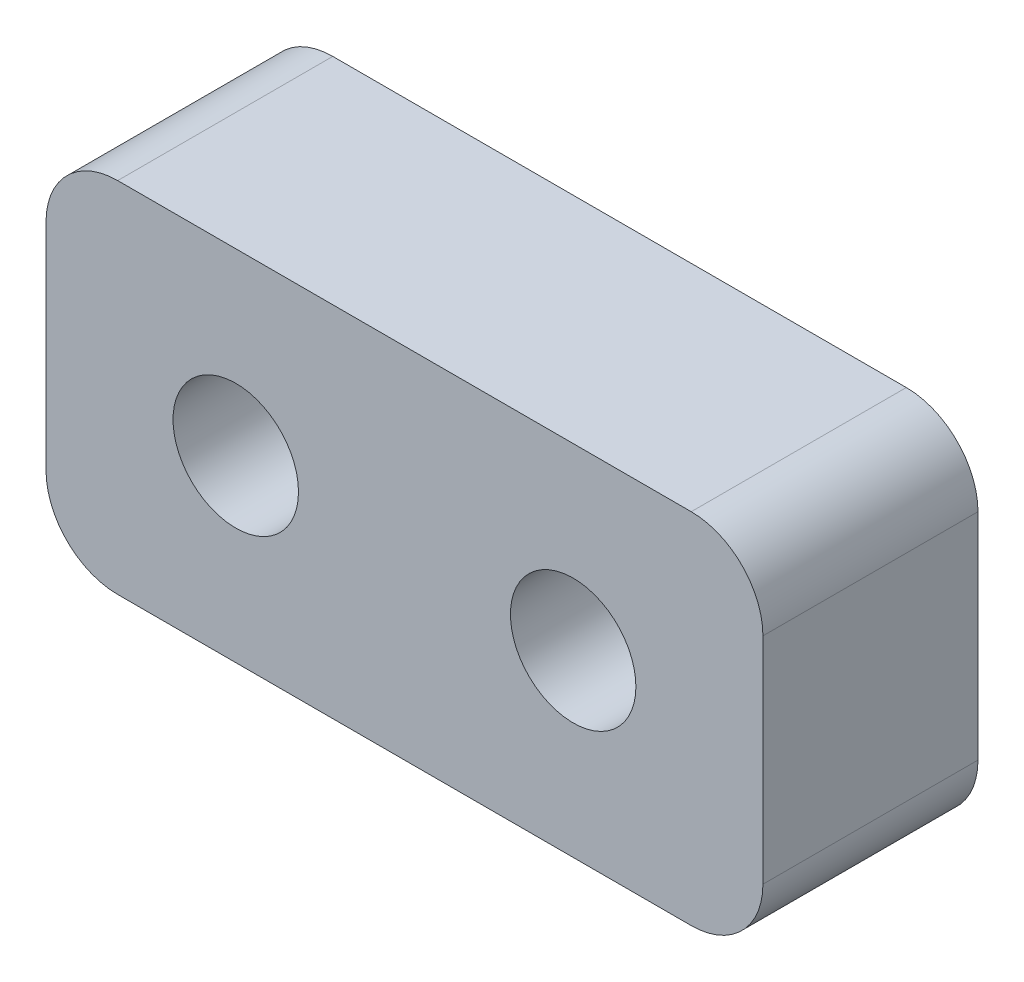
ISO-10303-21;
HEADER;
FILE_DESCRIPTION(('STEP AP214'),'2;1');
FILE_NAME('part.step','',(''),(''),'','','');
FILE_SCHEMA(('AUTOMOTIVE_DESIGN { 1 0 10303 214 1 1 1 1 }'));
ENDSEC;
DATA;
#1=APPLICATION_CONTEXT('core data for automotive mechanical design processes');
#2=APPLICATION_PROTOCOL_DEFINITION('international standard','automotive_design',2000,#1);
#3=PRODUCT_CONTEXT('',#1,'mechanical');
#4=PRODUCT('Part','Part','',(#3));
#5=PRODUCT_RELATED_PRODUCT_CATEGORY('part','',(#4));
#6=PRODUCT_DEFINITION_FORMATION('','',#4);
#7=PRODUCT_DEFINITION_CONTEXT('part definition',#1,'design');
#8=PRODUCT_DEFINITION('design','',#6,#7);
#9=PRODUCT_DEFINITION_SHAPE('','',#8);
#10=(LENGTH_UNIT() NAMED_UNIT(*) SI_UNIT(.MILLI.,.METRE.));
#11=(NAMED_UNIT(*) PLANE_ANGLE_UNIT() SI_UNIT($,.RADIAN.));
#12=(NAMED_UNIT(*) SI_UNIT($,.STERADIAN.) SOLID_ANGLE_UNIT());
#13=UNCERTAINTY_MEASURE_WITH_UNIT(LENGTH_MEASURE(1.E-05),#10,'distance_accuracy_value','');
#14=(GEOMETRIC_REPRESENTATION_CONTEXT(3) GLOBAL_UNCERTAINTY_ASSIGNED_CONTEXT((#13)) GLOBAL_UNIT_ASSIGNED_CONTEXT((#10,
#11,#12)) REPRESENTATION_CONTEXT('',''));
#15=CARTESIAN_POINT('',(0.,0.,0.));
#16=DIRECTION('',(0.,0.,1.));
#17=DIRECTION('',(1.,0.,0.));
#18=AXIS2_PLACEMENT_3D('',#15,#16,#17);
#19=CARTESIAN_POINT('',(20.,10.,12.));
#20=DIRECTION('',(-1.,0.,0.));
#21=DIRECTION('',(0.,-1.,0.));
#22=AXIS2_PLACEMENT_3D('',#19,#20,#21);
#23=PLANE('',#22);
#24=DIRECTION('',(0.,1.,0.));
#25=VECTOR('',#24,1.);
#26=CARTESIAN_POINT('',(20.,10.,12.));
#27=LINE('',#26,#25);
#28=CARTESIAN_POINT('',(20.,-6.,12.));
#29=VERTEX_POINT('',#28);
#30=CARTESIAN_POINT('',(20.,6.,12.));
#31=VERTEX_POINT('',#30);
#32=EDGE_CURVE('E127',#29,#31,#27,.T.);
#33=ORIENTED_EDGE('',*,*,#32,.F.);
#34=DIRECTION('',(0.,0.,-1.));
#35=VECTOR('',#34,1.);
#36=CARTESIAN_POINT('',(20.,-6.,12.));
#37=LINE('',#36,#35);
#38=CARTESIAN_POINT('',(20.,-6.,0.));
#39=VERTEX_POINT('',#38);
#40=EDGE_CURVE('E153',#29,#39,#37,.T.);
#41=ORIENTED_EDGE('',*,*,#40,.T.);
#42=DIRECTION('',(0.,1.,0.));
#43=VECTOR('',#42,1.);
#44=CARTESIAN_POINT('',(20.,10.,0.));
#45=LINE('',#44,#43);
#46=CARTESIAN_POINT('',(20.,6.,0.));
#47=VERTEX_POINT('',#46);
#48=EDGE_CURVE('E159',#39,#47,#45,.T.);
#49=ORIENTED_EDGE('',*,*,#48,.T.);
#50=DIRECTION('',(0.,0.,-1.));
#51=VECTOR('',#50,1.);
#52=CARTESIAN_POINT('',(20.,6.,12.));
#53=LINE('',#52,#51);
#54=EDGE_CURVE('E151',#47,#31,#53,.F.);
#55=ORIENTED_EDGE('',*,*,#54,.T.);
#56=EDGE_LOOP('',(#33,#41,#49,#55));
#57=FACE_BOUND('',#56,.T.);
#58=ADVANCED_FACE('F35',(#57),#23,.F.);
#59=CARTESIAN_POINT('',(-20.,10.,12.));
#60=DIRECTION('',(0.,-1.,0.));
#61=DIRECTION('',(0.,0.,-1.));
#62=AXIS2_PLACEMENT_3D('',#59,#60,#61);
#63=PLANE('',#62);
#64=DIRECTION('',(-1.,0.,0.));
#65=VECTOR('',#64,1.);
#66=CARTESIAN_POINT('',(-20.,10.,12.));
#67=LINE('',#66,#65);
#68=CARTESIAN_POINT('',(16.,10.,12.));
#69=VERTEX_POINT('',#68);
#70=CARTESIAN_POINT('',(-16.,10.,12.));
#71=VERTEX_POINT('',#70);
#72=EDGE_CURVE('E130',#69,#71,#67,.T.);
#73=ORIENTED_EDGE('',*,*,#72,.F.);
#74=DIRECTION('',(0.,0.,-1.));
#75=VECTOR('',#74,1.);
#76=CARTESIAN_POINT('',(16.,10.,12.));
#77=LINE('',#76,#75);
#78=CARTESIAN_POINT('',(16.,10.,0.));
#79=VERTEX_POINT('',#78);
#80=EDGE_CURVE('E12',#69,#79,#77,.T.);
#81=ORIENTED_EDGE('',*,*,#80,.T.);
#82=DIRECTION('',(-1.,0.,0.));
#83=VECTOR('',#82,1.);
#84=CARTESIAN_POINT('',(-20.,10.,0.));
#85=LINE('',#84,#83);
#86=CARTESIAN_POINT('',(-16.,10.,0.));
#87=VERTEX_POINT('',#86);
#88=EDGE_CURVE('E132',#79,#87,#85,.T.);
#89=ORIENTED_EDGE('',*,*,#88,.T.);
#90=DIRECTION('',(0.,0.,-1.));
#91=VECTOR('',#90,1.);
#92=CARTESIAN_POINT('',(-16.,10.,12.));
#93=LINE('',#92,#91);
#94=EDGE_CURVE('E43',#87,#71,#93,.F.);
#95=ORIENTED_EDGE('',*,*,#94,.T.);
#96=EDGE_LOOP('',(#73,#81,#89,#95));
#97=FACE_BOUND('',#96,.T.);
#98=ADVANCED_FACE('F229',(#97),#63,.F.);
#99=CARTESIAN_POINT('',(-20.,10.,12.));
#100=DIRECTION('',(1.,0.,0.));
#101=DIRECTION('',(0.,1.,0.));
#102=AXIS2_PLACEMENT_3D('',#99,#100,#101);
#103=PLANE('',#102);
#104=DIRECTION('',(0.,-1.,0.));
#105=VECTOR('',#104,1.);
#106=CARTESIAN_POINT('',(-20.,10.,0.));
#107=LINE('',#106,#105);
#108=CARTESIAN_POINT('',(-20.,6.,0.));
#109=VERTEX_POINT('',#108);
#110=CARTESIAN_POINT('',(-20.,-6.,0.));
#111=VERTEX_POINT('',#110);
#112=EDGE_CURVE('E128',#109,#111,#107,.T.);
#113=ORIENTED_EDGE('',*,*,#112,.T.);
#114=DIRECTION('',(0.,0.,-1.));
#115=VECTOR('',#114,1.);
#116=CARTESIAN_POINT('',(-20.,-6.,12.));
#117=LINE('',#116,#115);
#118=CARTESIAN_POINT('',(-20.,-6.,12.));
#119=VERTEX_POINT('',#118);
#120=EDGE_CURVE('E106',#111,#119,#117,.F.);
#121=ORIENTED_EDGE('',*,*,#120,.T.);
#122=DIRECTION('',(0.,-1.,0.));
#123=VECTOR('',#122,1.);
#124=CARTESIAN_POINT('',(-20.,10.,12.));
#125=LINE('',#124,#123);
#126=CARTESIAN_POINT('',(-20.,6.,12.));
#127=VERTEX_POINT('',#126);
#128=EDGE_CURVE('E171',#127,#119,#125,.T.);
#129=ORIENTED_EDGE('',*,*,#128,.F.);
#130=DIRECTION('',(0.,0.,-1.));
#131=VECTOR('',#130,1.);
#132=CARTESIAN_POINT('',(-20.,6.,12.));
#133=LINE('',#132,#131);
#134=EDGE_CURVE('E111',#127,#109,#133,.T.);
#135=ORIENTED_EDGE('',*,*,#134,.T.);
#136=EDGE_LOOP('',(#113,#121,#129,#135));
#137=FACE_BOUND('',#136,.T.);
#138=ADVANCED_FACE('F227',(#137),#103,.F.);
#139=CARTESIAN_POINT('',(-20.,-10.,12.));
#140=DIRECTION('',(0.,1.,0.));
#141=DIRECTION('',(0.,0.,1.));
#142=AXIS2_PLACEMENT_3D('',#139,#140,#141);
#143=PLANE('',#142);
#144=DIRECTION('',(1.,0.,0.));
#145=VECTOR('',#144,1.);
#146=CARTESIAN_POINT('',(-20.,-10.,12.));
#147=LINE('',#146,#145);
#148=CARTESIAN_POINT('',(-16.,-10.,12.));
#149=VERTEX_POINT('',#148);
#150=CARTESIAN_POINT('',(16.,-10.,12.));
#151=VERTEX_POINT('',#150);
#152=EDGE_CURVE('E121',#149,#151,#147,.T.);
#153=ORIENTED_EDGE('',*,*,#152,.F.);
#154=DIRECTION('',(0.,0.,-1.));
#155=VECTOR('',#154,1.);
#156=CARTESIAN_POINT('',(-16.,-10.,12.));
#157=LINE('',#156,#155);
#158=CARTESIAN_POINT('',(-16.,-10.,0.));
#159=VERTEX_POINT('',#158);
#160=EDGE_CURVE('E105',#149,#159,#157,.T.);
#161=ORIENTED_EDGE('',*,*,#160,.T.);
#162=DIRECTION('',(1.,0.,0.));
#163=VECTOR('',#162,1.);
#164=CARTESIAN_POINT('',(-20.,-10.,0.));
#165=LINE('',#164,#163);
#166=CARTESIAN_POINT('',(16.,-10.,0.));
#167=VERTEX_POINT('',#166);
#168=EDGE_CURVE('E118',#159,#167,#165,.T.);
#169=ORIENTED_EDGE('',*,*,#168,.T.);
#170=DIRECTION('',(0.,0.,-1.));
#171=VECTOR('',#170,1.);
#172=CARTESIAN_POINT('',(16.,-10.,12.));
#173=LINE('',#172,#171);
#174=EDGE_CURVE('E123',#167,#151,#173,.F.);
#175=ORIENTED_EDGE('',*,*,#174,.T.);
#176=EDGE_LOOP('',(#153,#161,#169,#175));
#177=FACE_BOUND('',#176,.T.);
#178=ADVANCED_FACE('F117',(#177),#143,.F.);
#179=CARTESIAN_POINT('',(0.,0.,12.));
#180=DIRECTION('',(0.,0.,1.));
#181=DIRECTION('',(1.,0.,0.));
#182=AXIS2_PLACEMENT_3D('',#179,#180,#181);
#183=PLANE('',#182);
#184=CARTESIAN_POINT('',(-9.41266553042247,0.,12.));
#185=DIRECTION('',(0.,0.,1.));
#186=DIRECTION('',(1.,0.,0.));
#187=AXIS2_PLACEMENT_3D('',#184,#185,#186);
#188=CIRCLE('',#187,3.5);
#189=CARTESIAN_POINT('',(-5.91266553042247,0.,12.));
#190=VERTEX_POINT('',#189);
#191=EDGE_CURVE('E181',#190,#190,#188,.T.);
#192=ORIENTED_EDGE('',*,*,#191,.F.);
#193=EDGE_LOOP('',(#192));
#194=FACE_BOUND('',#193,.T.);
#195=CARTESIAN_POINT('',(9.41266553042247,0.,12.));
#196=DIRECTION('',(0.,0.,1.));
#197=DIRECTION('',(1.,0.,0.));
#198=AXIS2_PLACEMENT_3D('',#195,#196,#197);
#199=CIRCLE('',#198,3.5);
#200=CARTESIAN_POINT('',(12.9126655304225,0.,12.));
#201=VERTEX_POINT('',#200);
#202=EDGE_CURVE('E182',#201,#201,#199,.T.);
#203=ORIENTED_EDGE('',*,*,#202,.F.);
#204=EDGE_LOOP('',(#203));
#205=FACE_BOUND('',#204,.T.);
#206=ORIENTED_EDGE('',*,*,#128,.T.);
#207=CARTESIAN_POINT('',(-16.,-6.,12.));
#208=DIRECTION('',(0.,0.,1.));
#209=DIRECTION('',(1.,0.,0.));
#210=AXIS2_PLACEMENT_3D('',#207,#208,#209);
#211=CIRCLE('',#210,4.);
#212=EDGE_CURVE('E149',#119,#149,#211,.T.);
#213=ORIENTED_EDGE('',*,*,#212,.T.);
#214=ORIENTED_EDGE('',*,*,#152,.T.);
#215=CARTESIAN_POINT('',(16.,-6.,12.));
#216=DIRECTION('',(0.,0.,1.));
#217=DIRECTION('',(1.,0.,0.));
#218=AXIS2_PLACEMENT_3D('',#215,#216,#217);
#219=CIRCLE('',#218,4.);
#220=EDGE_CURVE('E147',#151,#29,#219,.T.);
#221=ORIENTED_EDGE('',*,*,#220,.T.);
#222=ORIENTED_EDGE('',*,*,#32,.T.);
#223=CARTESIAN_POINT('',(16.,6.,12.));
#224=DIRECTION('',(0.,0.,1.));
#225=DIRECTION('',(1.,0.,0.));
#226=AXIS2_PLACEMENT_3D('',#223,#224,#225);
#227=CIRCLE('',#226,4.);
#228=EDGE_CURVE('E56',#31,#69,#227,.T.);
#229=ORIENTED_EDGE('',*,*,#228,.T.);
#230=ORIENTED_EDGE('',*,*,#72,.T.);
#231=CARTESIAN_POINT('',(-16.,6.,12.));
#232=DIRECTION('',(0.,0.,1.));
#233=DIRECTION('',(1.,0.,0.));
#234=AXIS2_PLACEMENT_3D('',#231,#232,#233);
#235=CIRCLE('',#234,4.);
#236=EDGE_CURVE('E144',#71,#127,#235,.T.);
#237=ORIENTED_EDGE('',*,*,#236,.T.);
#238=EDGE_LOOP('',(#206,#213,#214,#221,#222,#229,#230,#237));
#239=FACE_BOUND('',#238,.T.);
#240=ADVANCED_FACE('F218',(#194,#205,#239),#183,.T.);
#241=CARTESIAN_POINT('',(0.,0.,0.));
#242=DIRECTION('',(0.,0.,1.));
#243=DIRECTION('',(1.,0.,0.));
#244=AXIS2_PLACEMENT_3D('',#241,#242,#243);
#245=PLANE('',#244);
#246=CARTESIAN_POINT('',(-9.41266553042247,0.,0.));
#247=DIRECTION('',(0.,0.,1.));
#248=DIRECTION('',(1.,0.,0.));
#249=AXIS2_PLACEMENT_3D('',#246,#247,#248);
#250=CIRCLE('',#249,2.);
#251=CARTESIAN_POINT('',(-7.41266553042247,0.,0.));
#252=VERTEX_POINT('',#251);
#253=EDGE_CURVE('E185',#252,#252,#250,.F.);
#254=ORIENTED_EDGE('',*,*,#253,.F.);
#255=EDGE_LOOP('',(#254));
#256=FACE_BOUND('',#255,.T.);
#257=CARTESIAN_POINT('',(9.41266553042247,0.,0.));
#258=DIRECTION('',(0.,0.,1.));
#259=DIRECTION('',(1.,0.,0.));
#260=AXIS2_PLACEMENT_3D('',#257,#258,#259);
#261=CIRCLE('',#260,2.);
#262=CARTESIAN_POINT('',(11.4126655304225,0.,0.));
#263=VERTEX_POINT('',#262);
#264=EDGE_CURVE('E190',#263,#263,#261,.F.);
#265=ORIENTED_EDGE('',*,*,#264,.F.);
#266=EDGE_LOOP('',(#265));
#267=FACE_BOUND('',#266,.T.);
#268=CARTESIAN_POINT('',(0.,0.,0.));
#269=DIRECTION('',(0.,0.,-1.));
#270=DIRECTION('',(-1.,0.,0.));
#271=AXIS2_PLACEMENT_3D('',#268,#269,#270);
#272=CIRCLE('',#271,2.5);
#273=CARTESIAN_POINT('',(-2.5,0.,0.));
#274=VERTEX_POINT('',#273);
#275=EDGE_CURVE('E167',#274,#274,#272,.T.);
#276=ORIENTED_EDGE('',*,*,#275,.F.);
#277=EDGE_LOOP('',(#276));
#278=FACE_BOUND('',#277,.T.);
#279=ORIENTED_EDGE('',*,*,#168,.F.);
#280=CARTESIAN_POINT('',(-16.,-6.,0.));
#281=DIRECTION('',(0.,0.,1.));
#282=DIRECTION('',(1.,0.,0.));
#283=AXIS2_PLACEMENT_3D('',#280,#281,#282);
#284=CIRCLE('',#283,4.);
#285=EDGE_CURVE('E101',#159,#111,#284,.F.);
#286=ORIENTED_EDGE('',*,*,#285,.T.);
#287=ORIENTED_EDGE('',*,*,#112,.F.);
#288=CARTESIAN_POINT('',(-16.,6.,0.));
#289=DIRECTION('',(0.,0.,1.));
#290=DIRECTION('',(1.,0.,0.));
#291=AXIS2_PLACEMENT_3D('',#288,#289,#290);
#292=CIRCLE('',#291,4.);
#293=EDGE_CURVE('E122',#109,#87,#292,.F.);
#294=ORIENTED_EDGE('',*,*,#293,.T.);
#295=ORIENTED_EDGE('',*,*,#88,.F.);
#296=CARTESIAN_POINT('',(16.,6.,0.));
#297=DIRECTION('',(0.,0.,1.));
#298=DIRECTION('',(1.,0.,0.));
#299=AXIS2_PLACEMENT_3D('',#296,#297,#298);
#300=CIRCLE('',#299,4.);
#301=EDGE_CURVE('E138',#79,#47,#300,.F.);
#302=ORIENTED_EDGE('',*,*,#301,.T.);
#303=ORIENTED_EDGE('',*,*,#48,.F.);
#304=CARTESIAN_POINT('',(16.,-6.,0.));
#305=DIRECTION('',(0.,0.,1.));
#306=DIRECTION('',(1.,0.,0.));
#307=AXIS2_PLACEMENT_3D('',#304,#305,#306);
#308=CIRCLE('',#307,4.);
#309=EDGE_CURVE('E112',#39,#167,#308,.F.);
#310=ORIENTED_EDGE('',*,*,#309,.T.);
#311=EDGE_LOOP('',(#279,#286,#287,#294,#295,#302,#303,#310));
#312=FACE_BOUND('',#311,.T.);
#313=ADVANCED_FACE('F125',(#256,#267,#278,#312),#245,.F.);
#314=CARTESIAN_POINT('',(-16.,-6.,12.));
#315=DIRECTION('',(0.,0.,-1.));
#316=DIRECTION('',(-1.,0.,0.));
#317=AXIS2_PLACEMENT_3D('',#314,#315,#316);
#318=CYLINDRICAL_SURFACE('',#317,4.);
#319=ORIENTED_EDGE('',*,*,#212,.F.);
#320=ORIENTED_EDGE('',*,*,#120,.F.);
#321=ORIENTED_EDGE('',*,*,#285,.F.);
#322=ORIENTED_EDGE('',*,*,#160,.F.);
#323=EDGE_LOOP('',(#319,#320,#321,#322));
#324=FACE_BOUND('',#323,.T.);
#325=ADVANCED_FACE('F104',(#324),#318,.T.);
#326=CARTESIAN_POINT('',(16.,-6.,12.));
#327=DIRECTION('',(0.,0.,-1.));
#328=DIRECTION('',(-1.,0.,0.));
#329=AXIS2_PLACEMENT_3D('',#326,#327,#328);
#330=CYLINDRICAL_SURFACE('',#329,4.);
#331=ORIENTED_EDGE('',*,*,#220,.F.);
#332=ORIENTED_EDGE('',*,*,#174,.F.);
#333=ORIENTED_EDGE('',*,*,#309,.F.);
#334=ORIENTED_EDGE('',*,*,#40,.F.);
#335=EDGE_LOOP('',(#331,#332,#333,#334));
#336=FACE_BOUND('',#335,.T.);
#337=ADVANCED_FACE('F233',(#336),#330,.T.);
#338=CARTESIAN_POINT('',(16.,6.,12.));
#339=DIRECTION('',(0.,0.,-1.));
#340=DIRECTION('',(-1.,0.,0.));
#341=AXIS2_PLACEMENT_3D('',#338,#339,#340);
#342=CYLINDRICAL_SURFACE('',#341,4.);
#343=ORIENTED_EDGE('',*,*,#228,.F.);
#344=ORIENTED_EDGE('',*,*,#54,.F.);
#345=ORIENTED_EDGE('',*,*,#301,.F.);
#346=ORIENTED_EDGE('',*,*,#80,.F.);
#347=EDGE_LOOP('',(#343,#344,#345,#346));
#348=FACE_BOUND('',#347,.T.);
#349=ADVANCED_FACE('F232',(#348),#342,.T.);
#350=CARTESIAN_POINT('',(-16.,6.,12.));
#351=DIRECTION('',(0.,0.,-1.));
#352=DIRECTION('',(-1.,0.,0.));
#353=AXIS2_PLACEMENT_3D('',#350,#351,#352);
#354=CYLINDRICAL_SURFACE('',#353,4.);
#355=ORIENTED_EDGE('',*,*,#236,.F.);
#356=ORIENTED_EDGE('',*,*,#94,.F.);
#357=ORIENTED_EDGE('',*,*,#293,.F.);
#358=ORIENTED_EDGE('',*,*,#134,.F.);
#359=EDGE_LOOP('',(#355,#356,#357,#358));
#360=FACE_BOUND('',#359,.T.);
#361=ADVANCED_FACE('F37',(#360),#354,.T.);
#362=CARTESIAN_POINT('',(0.,0.,8.));
#363=DIRECTION('',(0.,0.,-1.));
#364=DIRECTION('',(-1.,0.,0.));
#365=AXIS2_PLACEMENT_3D('',#362,#363,#364);
#366=CYLINDRICAL_SURFACE('',#365,2.5);
#367=CARTESIAN_POINT('',(0.,0.,8.));
#368=DIRECTION('',(0.,0.,-1.));
#369=DIRECTION('',(-1.,0.,0.));
#370=AXIS2_PLACEMENT_3D('',#367,#368,#369);
#371=CIRCLE('',#370,2.5);
#372=CARTESIAN_POINT('',(-2.5,0.,8.));
#373=VERTEX_POINT('',#372);
#374=EDGE_CURVE('E164',#373,#373,#371,.T.);
#375=ORIENTED_EDGE('',*,*,#374,.F.);
#376=EDGE_LOOP('',(#375));
#377=FACE_BOUND('',#376,.T.);
#378=ORIENTED_EDGE('',*,*,#275,.T.);
#379=EDGE_LOOP('',(#378));
#380=FACE_BOUND('',#379,.T.);
#381=ADVANCED_FACE('F255',(#377,#380),#366,.F.);
#382=CARTESIAN_POINT('',(0.,0.,8.));
#383=DIRECTION('',(0.,0.,-1.));
#384=DIRECTION('',(-1.,0.,0.));
#385=AXIS2_PLACEMENT_3D('',#382,#383,#384);
#386=PLANE('',#385);
#387=ORIENTED_EDGE('',*,*,#374,.T.);
#388=EDGE_LOOP('',(#387));
#389=FACE_BOUND('',#388,.T.);
#390=ADVANCED_FACE('F258',(#389),#386,.T.);
#391=CARTESIAN_POINT('',(9.41266553042247,0.,-9.89949493661167));
#392=DIRECTION('',(0.,0.,1.));
#393=DIRECTION('',(1.,0.,0.));
#394=AXIS2_PLACEMENT_3D('',#391,#392,#393);
#395=CYLINDRICAL_SURFACE('',#394,3.5);
#396=CARTESIAN_POINT('',(9.41266553042247,0.,2.));
#397=DIRECTION('',(0.,0.,1.));
#398=DIRECTION('',(1.,0.,0.));
#399=AXIS2_PLACEMENT_3D('',#396,#397,#398);
#400=CIRCLE('',#399,3.5);
#401=CARTESIAN_POINT('',(12.9126655304225,0.,2.));
#402=VERTEX_POINT('',#401);
#403=EDGE_CURVE('E178',#402,#402,#400,.F.);
#404=ORIENTED_EDGE('',*,*,#403,.T.);
#405=EDGE_LOOP('',(#404));
#406=FACE_BOUND('',#405,.T.);
#407=ORIENTED_EDGE('',*,*,#202,.T.);
#408=EDGE_LOOP('',(#407));
#409=FACE_BOUND('',#408,.T.);
#410=ADVANCED_FACE('F262',(#406,#409),#395,.F.);
#411=CARTESIAN_POINT('',(0.,0.,2.));
#412=DIRECTION('',(0.,0.,1.));
#413=DIRECTION('',(1.,0.,0.));
#414=AXIS2_PLACEMENT_3D('',#411,#412,#413);
#415=PLANE('',#414);
#416=CARTESIAN_POINT('',(9.41266553042247,0.,2.));
#417=DIRECTION('',(0.,0.,1.));
#418=DIRECTION('',(1.,0.,0.));
#419=AXIS2_PLACEMENT_3D('',#416,#417,#418);
#420=CIRCLE('',#419,2.);
#421=CARTESIAN_POINT('',(11.4126655304225,0.,2.));
#422=VERTEX_POINT('',#421);
#423=EDGE_CURVE('E194',#422,#422,#420,.T.);
#424=ORIENTED_EDGE('',*,*,#423,.F.);
#425=EDGE_LOOP('',(#424));
#426=FACE_BOUND('',#425,.T.);
#427=ORIENTED_EDGE('',*,*,#403,.F.);
#428=EDGE_LOOP('',(#427));
#429=FACE_BOUND('',#428,.T.);
#430=ADVANCED_FACE('F214',(#426,#429),#415,.T.);
#431=CARTESIAN_POINT('',(-9.41266553042247,0.,-9.89949493661167));
#432=DIRECTION('',(0.,0.,1.));
#433=DIRECTION('',(1.,0.,0.));
#434=AXIS2_PLACEMENT_3D('',#431,#432,#433);
#435=CYLINDRICAL_SURFACE('',#434,3.5);
#436=CARTESIAN_POINT('',(-9.41266553042247,0.,2.));
#437=DIRECTION('',(0.,0.,1.));
#438=DIRECTION('',(1.,0.,0.));
#439=AXIS2_PLACEMENT_3D('',#436,#437,#438);
#440=CIRCLE('',#439,3.5);
#441=CARTESIAN_POINT('',(-5.91266553042247,0.,2.));
#442=VERTEX_POINT('',#441);
#443=EDGE_CURVE('E176',#442,#442,#440,.F.);
#444=ORIENTED_EDGE('',*,*,#443,.T.);
#445=EDGE_LOOP('',(#444));
#446=FACE_BOUND('',#445,.T.);
#447=ORIENTED_EDGE('',*,*,#191,.T.);
#448=EDGE_LOOP('',(#447));
#449=FACE_BOUND('',#448,.T.);
#450=ADVANCED_FACE('F208',(#446,#449),#435,.F.);
#451=CARTESIAN_POINT('',(0.,0.,2.));
#452=DIRECTION('',(0.,0.,1.));
#453=DIRECTION('',(1.,0.,0.));
#454=AXIS2_PLACEMENT_3D('',#451,#452,#453);
#455=PLANE('',#454);
#456=CARTESIAN_POINT('',(-9.41266553042247,0.,2.));
#457=DIRECTION('',(0.,0.,1.));
#458=DIRECTION('',(1.,0.,0.));
#459=AXIS2_PLACEMENT_3D('',#456,#457,#458);
#460=CIRCLE('',#459,2.);
#461=CARTESIAN_POINT('',(-7.41266553042247,0.,2.));
#462=VERTEX_POINT('',#461);
#463=EDGE_CURVE('E193',#462,#462,#460,.T.);
#464=ORIENTED_EDGE('',*,*,#463,.F.);
#465=EDGE_LOOP('',(#464));
#466=FACE_BOUND('',#465,.T.);
#467=ORIENTED_EDGE('',*,*,#443,.F.);
#468=EDGE_LOOP('',(#467));
#469=FACE_BOUND('',#468,.T.);
#470=ADVANCED_FACE('F204',(#466,#469),#455,.T.);
#471=CARTESIAN_POINT('',(9.41266553042247,0.,-5.65685424949238));
#472=DIRECTION('',(0.,0.,1.));
#473=DIRECTION('',(1.,0.,0.));
#474=AXIS2_PLACEMENT_3D('',#471,#472,#473);
#475=CYLINDRICAL_SURFACE('',#474,2.);
#476=ORIENTED_EDGE('',*,*,#264,.T.);
#477=EDGE_LOOP('',(#476));
#478=FACE_BOUND('',#477,.T.);
#479=ORIENTED_EDGE('',*,*,#423,.T.);
#480=EDGE_LOOP('',(#479));
#481=FACE_BOUND('',#480,.T.);
#482=ADVANCED_FACE('F207',(#478,#481),#475,.F.);
#483=CARTESIAN_POINT('',(-9.41266553042247,0.,-5.65685424949238));
#484=DIRECTION('',(0.,0.,1.));
#485=DIRECTION('',(1.,0.,0.));
#486=AXIS2_PLACEMENT_3D('',#483,#484,#485);
#487=CYLINDRICAL_SURFACE('',#486,2.);
#488=ORIENTED_EDGE('',*,*,#253,.T.);
#489=EDGE_LOOP('',(#488));
#490=FACE_BOUND('',#489,.T.);
#491=ORIENTED_EDGE('',*,*,#463,.T.);
#492=EDGE_LOOP('',(#491));
#493=FACE_BOUND('',#492,.T.);
#494=ADVANCED_FACE('F202',(#490,#493),#487,.F.);
#495=CLOSED_SHELL('',(#58,#98,#138,#178,#240,#313,#325,#337,#349,#361,#381,#390,#410,#430,#450,
#470,#482,#494));
#496=MANIFOLD_SOLID_BREP('B2',#495);
#497=ADVANCED_BREP_SHAPE_REPRESENTATION('',(#18,#496),#14);
#498=SHAPE_DEFINITION_REPRESENTATION(#9,#497);
ENDSEC;
END-ISO-10303-21;
